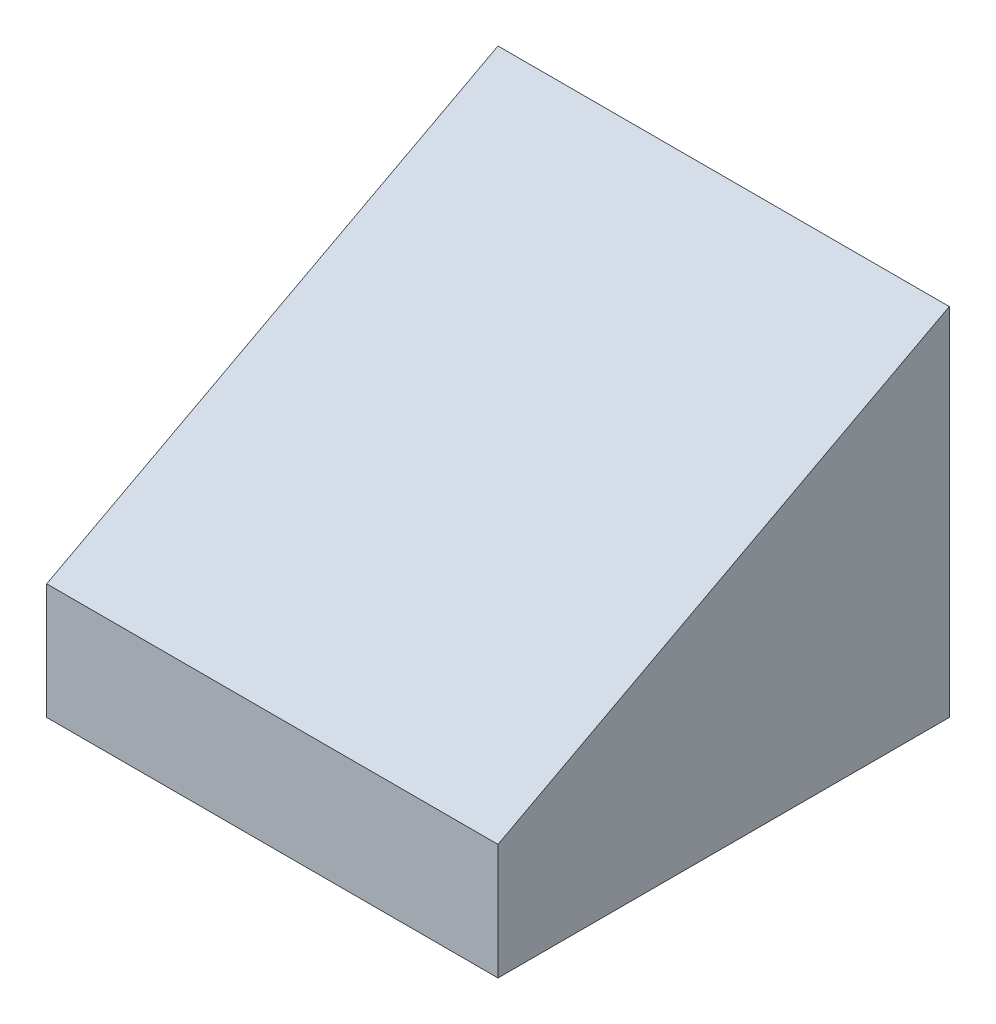
ISO-10303-21;
HEADER;
FILE_DESCRIPTION(('STEP AP214'),'2;1');
FILE_NAME('part.step','',(''),(''),'','','');
FILE_SCHEMA(('AUTOMOTIVE_DESIGN { 1 0 10303 214 1 1 1 1 }'));
ENDSEC;
DATA;
#1=APPLICATION_CONTEXT('core data for automotive mechanical design processes');
#2=APPLICATION_PROTOCOL_DEFINITION('international standard','automotive_design',2000,#1);
#3=PRODUCT_CONTEXT('',#1,'mechanical');
#4=PRODUCT('Part','Part','',(#3));
#5=PRODUCT_RELATED_PRODUCT_CATEGORY('part','',(#4));
#6=PRODUCT_DEFINITION_FORMATION('','',#4);
#7=PRODUCT_DEFINITION_CONTEXT('part definition',#1,'design');
#8=PRODUCT_DEFINITION('design','',#6,#7);
#9=PRODUCT_DEFINITION_SHAPE('','',#8);
#10=(LENGTH_UNIT() NAMED_UNIT(*) SI_UNIT(.MILLI.,.METRE.));
#11=(NAMED_UNIT(*) PLANE_ANGLE_UNIT() SI_UNIT($,.RADIAN.));
#12=(NAMED_UNIT(*) SI_UNIT($,.STERADIAN.) SOLID_ANGLE_UNIT());
#13=UNCERTAINTY_MEASURE_WITH_UNIT(LENGTH_MEASURE(1.E-05),#10,'distance_accuracy_value','');
#14=(GEOMETRIC_REPRESENTATION_CONTEXT(3) GLOBAL_UNCERTAINTY_ASSIGNED_CONTEXT((#13)) GLOBAL_UNIT_ASSIGNED_CONTEXT((#10,
#11,#12)) REPRESENTATION_CONTEXT('',''));
#15=CARTESIAN_POINT('',(0.,0.,0.));
#16=DIRECTION('',(0.,0.,1.));
#17=DIRECTION('',(1.,0.,0.));
#18=AXIS2_PLACEMENT_3D('',#15,#16,#17);
#19=CARTESIAN_POINT('',(-7.8,0.,0.));
#20=DIRECTION('',(0.,-1.,0.));
#21=DIRECTION('',(0.,0.,-1.));
#22=AXIS2_PLACEMENT_3D('',#19,#20,#21);
#23=PLANE('',#22);
#24=DIRECTION('',(0.,0.,-1.));
#25=VECTOR('',#24,1.);
#26=CARTESIAN_POINT('',(0.,0.,0.));
#27=LINE('',#26,#25);
#28=CARTESIAN_POINT('',(0.,0.,7.8));
#29=VERTEX_POINT('',#28);
#30=CARTESIAN_POINT('',(0.,0.,0.));
#31=VERTEX_POINT('',#30);
#32=EDGE_CURVE('E150',#29,#31,#27,.T.);
#33=ORIENTED_EDGE('',*,*,#32,.F.);
#34=DIRECTION('',(1.,0.,0.));
#35=VECTOR('',#34,1.);
#36=CARTESIAN_POINT('',(-7.8,0.,7.8));
#37=LINE('',#36,#35);
#38=CARTESIAN_POINT('',(-7.8,0.,7.8));
#39=VERTEX_POINT('',#38);
#40=EDGE_CURVE('E42',#39,#29,#37,.T.);
#41=ORIENTED_EDGE('',*,*,#40,.F.);
#42=DIRECTION('',(0.,0.,-1.));
#43=VECTOR('',#42,1.);
#44=CARTESIAN_POINT('',(-7.8,0.,0.));
#45=LINE('',#44,#43);
#46=CARTESIAN_POINT('',(-7.8,0.,0.));
#47=VERTEX_POINT('',#46);
#48=EDGE_CURVE('E155',#39,#47,#45,.T.);
#49=ORIENTED_EDGE('',*,*,#48,.T.);
#50=DIRECTION('',(1.,0.,0.));
#51=VECTOR('',#50,1.);
#52=CARTESIAN_POINT('',(-7.8,0.,0.));
#53=LINE('',#52,#51);
#54=EDGE_CURVE('E11',#47,#31,#53,.T.);
#55=ORIENTED_EDGE('',*,*,#54,.T.);
#56=EDGE_LOOP('',(#33,#41,#49,#55));
#57=FACE_BOUND('',#56,.T.);
#58=DIRECTION('',(1.,0.,0.));
#59=VECTOR('',#58,1.);
#60=CARTESIAN_POINT('',(-7.8,0.,6.3));
#61=LINE('',#60,#59);
#62=CARTESIAN_POINT('',(-6.3,0.,6.3));
#63=VERTEX_POINT('',#62);
#64=CARTESIAN_POINT('',(-1.5,0.,6.3));
#65=VERTEX_POINT('',#64);
#66=EDGE_CURVE('E138',#63,#65,#61,.T.);
#67=ORIENTED_EDGE('',*,*,#66,.T.);
#68=DIRECTION('',(0.,0.,-1.));
#69=VECTOR('',#68,1.);
#70=CARTESIAN_POINT('',(-1.5,0.,0.));
#71=LINE('',#70,#69);
#72=CARTESIAN_POINT('',(-1.5,0.,1.5));
#73=VERTEX_POINT('',#72);
#74=EDGE_CURVE('E133',#65,#73,#71,.T.);
#75=ORIENTED_EDGE('',*,*,#74,.T.);
#76=DIRECTION('',(1.,0.,0.));
#77=VECTOR('',#76,1.);
#78=CARTESIAN_POINT('',(-7.8,0.,1.5));
#79=LINE('',#78,#77);
#80=CARTESIAN_POINT('',(-6.3,0.,1.5));
#81=VERTEX_POINT('',#80);
#82=EDGE_CURVE('E129',#81,#73,#79,.T.);
#83=ORIENTED_EDGE('',*,*,#82,.F.);
#84=DIRECTION('',(0.,0.,-1.));
#85=VECTOR('',#84,1.);
#86=CARTESIAN_POINT('',(-6.3,0.,0.));
#87=LINE('',#86,#85);
#88=EDGE_CURVE('E50',#63,#81,#87,.T.);
#89=ORIENTED_EDGE('',*,*,#88,.F.);
#90=EDGE_LOOP('',(#67,#75,#83,#89));
#91=FACE_BOUND('',#90,.T.);
#92=ADVANCED_FACE('F33',(#57,#91),#23,.T.);
#93=CARTESIAN_POINT('',(-7.8,6.15,0.));
#94=DIRECTION('',(0.,0.,-1.));
#95=DIRECTION('',(0.,1.,0.));
#96=AXIS2_PLACEMENT_3D('',#93,#94,#95);
#97=PLANE('',#96);
#98=DIRECTION('',(0.,1.,0.));
#99=VECTOR('',#98,1.);
#100=CARTESIAN_POINT('',(0.,6.15,0.));
#101=LINE('',#100,#99);
#102=CARTESIAN_POINT('',(0.,6.15,0.));
#103=VERTEX_POINT('',#102);
#104=EDGE_CURVE('E142',#31,#103,#101,.T.);
#105=ORIENTED_EDGE('',*,*,#104,.F.);
#106=ORIENTED_EDGE('',*,*,#54,.F.);
#107=DIRECTION('',(0.,1.,0.));
#108=VECTOR('',#107,1.);
#109=CARTESIAN_POINT('',(-7.8,6.15,0.));
#110=LINE('',#109,#108);
#111=CARTESIAN_POINT('',(-7.8,6.15,0.));
#112=VERTEX_POINT('',#111);
#113=EDGE_CURVE('E147',#47,#112,#110,.T.);
#114=ORIENTED_EDGE('',*,*,#113,.T.);
#115=DIRECTION('',(1.,0.,0.));
#116=VECTOR('',#115,1.);
#117=CARTESIAN_POINT('',(-7.8,6.15,0.));
#118=LINE('',#117,#116);
#119=EDGE_CURVE('E37',#112,#103,#118,.T.);
#120=ORIENTED_EDGE('',*,*,#119,.T.);
#121=EDGE_LOOP('',(#105,#106,#114,#120));
#122=FACE_BOUND('',#121,.T.);
#123=ADVANCED_FACE('F35',(#122),#97,.T.);
#124=CARTESIAN_POINT('',(-7.8,0.,7.8));
#125=DIRECTION('',(0.,0.,1.));
#126=DIRECTION('',(1.,0.,0.));
#127=AXIS2_PLACEMENT_3D('',#124,#125,#126);
#128=PLANE('',#127);
#129=DIRECTION('',(0.,-1.,0.));
#130=VECTOR('',#129,1.);
#131=CARTESIAN_POINT('',(0.,0.,7.8));
#132=LINE('',#131,#130);
#133=CARTESIAN_POINT('',(0.,2.,7.8));
#134=VERTEX_POINT('',#133);
#135=EDGE_CURVE('E162',#134,#29,#132,.T.);
#136=ORIENTED_EDGE('',*,*,#135,.F.);
#137=DIRECTION('',(1.,0.,0.));
#138=VECTOR('',#137,1.);
#139=CARTESIAN_POINT('',(-7.8,2.,7.8));
#140=LINE('',#139,#138);
#141=CARTESIAN_POINT('',(-7.8,2.,7.8));
#142=VERTEX_POINT('',#141);
#143=EDGE_CURVE('E167',#142,#134,#140,.T.);
#144=ORIENTED_EDGE('',*,*,#143,.F.);
#145=DIRECTION('',(0.,-1.,0.));
#146=VECTOR('',#145,1.);
#147=CARTESIAN_POINT('',(-7.8,0.,7.8));
#148=LINE('',#147,#146);
#149=EDGE_CURVE('E152',#142,#39,#148,.T.);
#150=ORIENTED_EDGE('',*,*,#149,.T.);
#151=ORIENTED_EDGE('',*,*,#40,.T.);
#152=EDGE_LOOP('',(#136,#144,#150,#151));
#153=FACE_BOUND('',#152,.T.);
#154=ADVANCED_FACE('F176',(#153),#128,.T.);
#155=CARTESIAN_POINT('',(-7.8,2.,7.8));
#156=DIRECTION('',(0.,0.882822462559898,0.46970682302866));
#157=DIRECTION('',(0.,-0.46970682302866,0.882822462559898));
#158=AXIS2_PLACEMENT_3D('',#155,#156,#157);
#159=PLANE('',#158);
#160=DIRECTION('',(0.,-0.46970682302866,0.882822462559898));
#161=VECTOR('',#160,1.);
#162=CARTESIAN_POINT('',(0.,2.,7.8));
#163=LINE('',#162,#161);
#164=EDGE_CURVE('E159',#103,#134,#163,.T.);
#165=ORIENTED_EDGE('',*,*,#164,.F.);
#166=ORIENTED_EDGE('',*,*,#119,.F.);
#167=DIRECTION('',(0.,-0.46970682302866,0.882822462559898));
#168=VECTOR('',#167,1.);
#169=CARTESIAN_POINT('',(-7.8,2.,7.8));
#170=LINE('',#169,#168);
#171=EDGE_CURVE('E149',#112,#142,#170,.T.);
#172=ORIENTED_EDGE('',*,*,#171,.T.);
#173=ORIENTED_EDGE('',*,*,#143,.T.);
#174=EDGE_LOOP('',(#165,#166,#172,#173));
#175=FACE_BOUND('',#174,.T.);
#176=ADVANCED_FACE('F169',(#175),#159,.T.);
#177=CARTESIAN_POINT('',(-7.8,0.,0.));
#178=DIRECTION('',(-1.,0.,0.));
#179=DIRECTION('',(0.,0.,1.));
#180=AXIS2_PLACEMENT_3D('',#177,#178,#179);
#181=PLANE('',#180);
#182=ORIENTED_EDGE('',*,*,#113,.F.);
#183=ORIENTED_EDGE('',*,*,#48,.F.);
#184=ORIENTED_EDGE('',*,*,#149,.F.);
#185=ORIENTED_EDGE('',*,*,#171,.F.);
#186=EDGE_LOOP('',(#182,#183,#184,#185));
#187=FACE_BOUND('',#186,.T.);
#188=ADVANCED_FACE('F178',(#187),#181,.T.);
#189=CARTESIAN_POINT('',(0.,0.,0.));
#190=DIRECTION('',(-1.,0.,0.));
#191=DIRECTION('',(0.,0.,1.));
#192=AXIS2_PLACEMENT_3D('',#189,#190,#191);
#193=PLANE('',#192);
#194=ORIENTED_EDGE('',*,*,#104,.T.);
#195=ORIENTED_EDGE('',*,*,#164,.T.);
#196=ORIENTED_EDGE('',*,*,#135,.T.);
#197=ORIENTED_EDGE('',*,*,#32,.T.);
#198=EDGE_LOOP('',(#194,#195,#196,#197));
#199=FACE_BOUND('',#198,.T.);
#200=ADVANCED_FACE('F171',(#199),#193,.F.);
#201=CARTESIAN_POINT('',(-7.8,6.15000000000001,1.49999999999994));
#202=DIRECTION('',(0.,0.,-1.));
#203=DIRECTION('',(0.,1.,0.));
#204=AXIS2_PLACEMENT_3D('',#201,#202,#203);
#205=PLANE('',#204);
#206=DIRECTION('',(0.,1.,0.));
#207=VECTOR('',#206,1.);
#208=CARTESIAN_POINT('',(-1.5,6.15000000000001,1.49999999999994));
#209=LINE('',#208,#207);
#210=CARTESIAN_POINT('',(-1.5,3.65282720701227,1.49999999999997));
#211=VERTEX_POINT('',#210);
#212=EDGE_CURVE('E123',#73,#211,#209,.T.);
#213=ORIENTED_EDGE('',*,*,#212,.T.);
#214=DIRECTION('',(1.,0.,0.));
#215=VECTOR('',#214,1.);
#216=CARTESIAN_POINT('',(-7.8,3.65282720701228,1.49999999999997));
#217=LINE('',#216,#215);
#218=CARTESIAN_POINT('',(-6.3,3.65282720701227,1.49999999999997));
#219=VERTEX_POINT('',#218);
#220=EDGE_CURVE('E108',#219,#211,#217,.T.);
#221=ORIENTED_EDGE('',*,*,#220,.F.);
#222=DIRECTION('',(0.,1.,0.));
#223=VECTOR('',#222,1.);
#224=CARTESIAN_POINT('',(-6.3,6.15000000000001,1.49999999999994));
#225=LINE('',#224,#223);
#226=EDGE_CURVE('E132',#81,#219,#225,.T.);
#227=ORIENTED_EDGE('',*,*,#226,.F.);
#228=ORIENTED_EDGE('',*,*,#82,.T.);
#229=EDGE_LOOP('',(#213,#221,#227,#228));
#230=FACE_BOUND('',#229,.T.);
#231=ADVANCED_FACE('F127',(#230),#205,.F.);
#232=CARTESIAN_POINT('',(-7.8,0.,6.3));
#233=DIRECTION('',(0.,0.,1.));
#234=DIRECTION('',(1.,0.,0.));
#235=AXIS2_PLACEMENT_3D('',#232,#233,#234);
#236=PLANE('',#235);
#237=DIRECTION('',(0.,-1.,0.));
#238=VECTOR('',#237,1.);
#239=CARTESIAN_POINT('',(-1.5,0.,6.3));
#240=LINE('',#239,#238);
#241=CARTESIAN_POINT('',(-1.5,1.09898105316612,6.3));
#242=VERTEX_POINT('',#241);
#243=EDGE_CURVE('E125',#242,#65,#240,.T.);
#244=ORIENTED_EDGE('',*,*,#243,.T.);
#245=ORIENTED_EDGE('',*,*,#66,.F.);
#246=DIRECTION('',(0.,-1.,0.));
#247=VECTOR('',#246,1.);
#248=CARTESIAN_POINT('',(-6.3,0.,6.3));
#249=LINE('',#248,#247);
#250=CARTESIAN_POINT('',(-6.3,1.09898105316612,6.3));
#251=VERTEX_POINT('',#250);
#252=EDGE_CURVE('E136',#251,#63,#249,.T.);
#253=ORIENTED_EDGE('',*,*,#252,.F.);
#254=DIRECTION('',(1.,0.,0.));
#255=VECTOR('',#254,1.);
#256=CARTESIAN_POINT('',(-7.8,1.09898105316612,6.3));
#257=LINE('',#256,#255);
#258=EDGE_CURVE('E116',#251,#242,#257,.T.);
#259=ORIENTED_EDGE('',*,*,#258,.T.);
#260=EDGE_LOOP('',(#244,#245,#253,#259));
#261=FACE_BOUND('',#260,.T.);
#262=ADVANCED_FACE('F225',(#261),#236,.F.);
#263=CARTESIAN_POINT('',(-7.8,0.675766306160152,7.09543976545701));
#264=DIRECTION('',(0.,0.882822462559898,0.46970682302866));
#265=DIRECTION('',(0.,-0.46970682302866,0.882822462559898));
#266=AXIS2_PLACEMENT_3D('',#263,#264,#265);
#267=PLANE('',#266);
#268=DIRECTION('',(0.,-0.46970682302866,0.882822462559898));
#269=VECTOR('',#268,1.);
#270=CARTESIAN_POINT('',(-1.5,0.675766306160152,7.09543976545701));
#271=LINE('',#270,#269);
#272=EDGE_CURVE('E111',#211,#242,#271,.T.);
#273=ORIENTED_EDGE('',*,*,#272,.T.);
#274=ORIENTED_EDGE('',*,*,#258,.F.);
#275=DIRECTION('',(0.,-0.46970682302866,0.882822462559898));
#276=VECTOR('',#275,1.);
#277=CARTESIAN_POINT('',(-6.3,0.675766306160152,7.09543976545701));
#278=LINE('',#277,#276);
#279=EDGE_CURVE('E113',#219,#251,#278,.T.);
#280=ORIENTED_EDGE('',*,*,#279,.F.);
#281=ORIENTED_EDGE('',*,*,#220,.T.);
#282=EDGE_LOOP('',(#273,#274,#280,#281));
#283=FACE_BOUND('',#282,.T.);
#284=ADVANCED_FACE('F110',(#283),#267,.F.);
#285=CARTESIAN_POINT('',(-6.3,0.,0.));
#286=DIRECTION('',(-1.,0.,0.));
#287=DIRECTION('',(0.,0.,1.));
#288=AXIS2_PLACEMENT_3D('',#285,#286,#287);
#289=PLANE('',#288);
#290=ORIENTED_EDGE('',*,*,#226,.T.);
#291=ORIENTED_EDGE('',*,*,#279,.T.);
#292=ORIENTED_EDGE('',*,*,#252,.T.);
#293=ORIENTED_EDGE('',*,*,#88,.T.);
#294=EDGE_LOOP('',(#290,#291,#292,#293));
#295=FACE_BOUND('',#294,.T.);
#296=ADVANCED_FACE('F241',(#295),#289,.F.);
#297=CARTESIAN_POINT('',(-1.5,0.,0.));
#298=DIRECTION('',(-1.,0.,0.));
#299=DIRECTION('',(0.,0.,1.));
#300=AXIS2_PLACEMENT_3D('',#297,#298,#299);
#301=PLANE('',#300);
#302=ORIENTED_EDGE('',*,*,#212,.F.);
#303=ORIENTED_EDGE('',*,*,#74,.F.);
#304=ORIENTED_EDGE('',*,*,#243,.F.);
#305=ORIENTED_EDGE('',*,*,#272,.F.);
#306=EDGE_LOOP('',(#302,#303,#304,#305));
#307=FACE_BOUND('',#306,.T.);
#308=ADVANCED_FACE('F121',(#307),#301,.T.);
#309=CLOSED_SHELL('',(#92,#123,#154,#176,#188,#200,#231,#262,#284,#296,#308));
#310=MANIFOLD_SOLID_BREP('B2',#309);
#311=ADVANCED_BREP_SHAPE_REPRESENTATION('',(#18,#310),#14);
#312=SHAPE_DEFINITION_REPRESENTATION(#9,#311);
ENDSEC;
END-ISO-10303-21;
